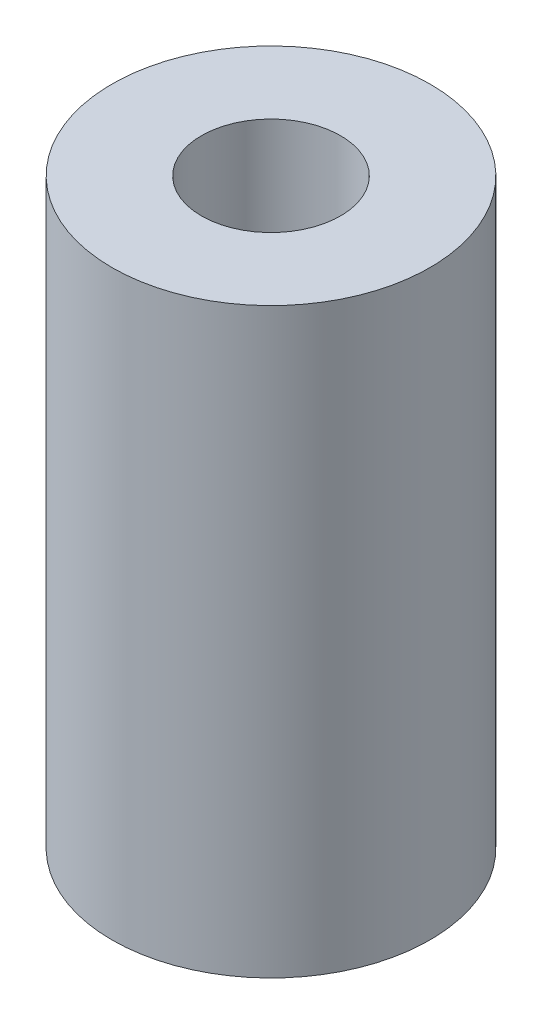
ISO-10303-21;
HEADER;
FILE_DESCRIPTION(('STEP AP214'),'2;1');
FILE_NAME('part.step','',(''),(''),'','','');
FILE_SCHEMA(('AUTOMOTIVE_DESIGN { 1 0 10303 214 1 1 1 1 }'));
ENDSEC;
DATA;
#1=APPLICATION_CONTEXT('core data for automotive mechanical design processes');
#2=APPLICATION_PROTOCOL_DEFINITION('international standard','automotive_design',2000,#1);
#3=PRODUCT_CONTEXT('',#1,'mechanical');
#4=PRODUCT('Part','Part','',(#3));
#5=PRODUCT_RELATED_PRODUCT_CATEGORY('part','',(#4));
#6=PRODUCT_DEFINITION_FORMATION('','',#4);
#7=PRODUCT_DEFINITION_CONTEXT('part definition',#1,'design');
#8=PRODUCT_DEFINITION('design','',#6,#7);
#9=PRODUCT_DEFINITION_SHAPE('','',#8);
#10=(LENGTH_UNIT() NAMED_UNIT(*) SI_UNIT(.MILLI.,.METRE.));
#11=(NAMED_UNIT(*) PLANE_ANGLE_UNIT() SI_UNIT($,.RADIAN.));
#12=(NAMED_UNIT(*) SI_UNIT($,.STERADIAN.) SOLID_ANGLE_UNIT());
#13=UNCERTAINTY_MEASURE_WITH_UNIT(LENGTH_MEASURE(1.E-05),#10,'distance_accuracy_value','');
#14=(GEOMETRIC_REPRESENTATION_CONTEXT(3) GLOBAL_UNCERTAINTY_ASSIGNED_CONTEXT((#13)) GLOBAL_UNIT_ASSIGNED_CONTEXT((#10,
#11,#12)) REPRESENTATION_CONTEXT('',''));
#15=CARTESIAN_POINT('',(0.,0.,0.));
#16=DIRECTION('',(0.,0.,1.));
#17=DIRECTION('',(1.,0.,0.));
#18=AXIS2_PLACEMENT_3D('',#15,#16,#17);
#19=CARTESIAN_POINT('',(0.,14.65,0.));
#20=DIRECTION('',(0.,1.,0.));
#21=DIRECTION('',(0.,0.,1.));
#22=AXIS2_PLACEMENT_3D('',#19,#20,#21);
#23=PLANE('',#22);
#24=CARTESIAN_POINT('',(0.,14.65,0.));
#25=DIRECTION('',(0.,1.,0.));
#26=DIRECTION('',(0.,0.,1.));
#27=AXIS2_PLACEMENT_3D('',#24,#25,#26);
#28=CIRCLE('',#27,4.);
#29=CARTESIAN_POINT('',(0.,14.65,4.));
#30=VERTEX_POINT('',#29);
#31=EDGE_CURVE('E10',#30,#30,#28,.T.);
#32=ORIENTED_EDGE('',*,*,#31,.T.);
#33=EDGE_LOOP('',(#32));
#34=FACE_BOUND('',#33,.T.);
#35=CARTESIAN_POINT('',(0.,14.65,0.));
#36=DIRECTION('',(0.,1.,0.));
#37=DIRECTION('',(0.,0.,1.));
#38=AXIS2_PLACEMENT_3D('',#35,#36,#37);
#39=CIRCLE('',#38,1.75);
#40=CARTESIAN_POINT('',(0.,14.65,1.75));
#41=VERTEX_POINT('',#40);
#42=EDGE_CURVE('E50',#41,#41,#39,.T.);
#43=ORIENTED_EDGE('',*,*,#42,.F.);
#44=EDGE_LOOP('',(#43));
#45=FACE_BOUND('',#44,.T.);
#46=ADVANCED_FACE('F39',(#34,#45),#23,.T.);
#47=CARTESIAN_POINT('',(0.,0.,0.));
#48=DIRECTION('',(0.,1.,0.));
#49=DIRECTION('',(0.,0.,1.));
#50=AXIS2_PLACEMENT_3D('',#47,#48,#49);
#51=PLANE('',#50);
#52=CARTESIAN_POINT('',(0.,0.,0.));
#53=DIRECTION('',(0.,1.,0.));
#54=DIRECTION('',(0.,0.,1.));
#55=AXIS2_PLACEMENT_3D('',#52,#53,#54);
#56=CIRCLE('',#55,4.);
#57=CARTESIAN_POINT('',(0.,0.,4.));
#58=VERTEX_POINT('',#57);
#59=EDGE_CURVE('E43',#58,#58,#56,.T.);
#60=ORIENTED_EDGE('',*,*,#59,.F.);
#61=EDGE_LOOP('',(#60));
#62=FACE_BOUND('',#61,.T.);
#63=CARTESIAN_POINT('',(0.,0.,0.));
#64=DIRECTION('',(0.,1.,0.));
#65=DIRECTION('',(0.,0.,1.));
#66=AXIS2_PLACEMENT_3D('',#63,#64,#65);
#67=CIRCLE('',#66,1.75);
#68=CARTESIAN_POINT('',(0.,0.,1.75));
#69=VERTEX_POINT('',#68);
#70=EDGE_CURVE('E52',#69,#69,#67,.T.);
#71=ORIENTED_EDGE('',*,*,#70,.T.);
#72=EDGE_LOOP('',(#71));
#73=FACE_BOUND('',#72,.T.);
#74=ADVANCED_FACE('F62',(#62,#73),#51,.F.);
#75=CARTESIAN_POINT('',(0.,14.65,0.));
#76=DIRECTION('',(0.,-1.,0.));
#77=DIRECTION('',(0.,0.,-1.));
#78=AXIS2_PLACEMENT_3D('',#75,#76,#77);
#79=CYLINDRICAL_SURFACE('',#78,4.);
#80=ORIENTED_EDGE('',*,*,#31,.F.);
#81=EDGE_LOOP('',(#80));
#82=FACE_BOUND('',#81,.T.);
#83=ORIENTED_EDGE('',*,*,#59,.T.);
#84=EDGE_LOOP('',(#83));
#85=FACE_BOUND('',#84,.T.);
#86=ADVANCED_FACE('F41',(#82,#85),#79,.T.);
#87=CARTESIAN_POINT('',(0.,14.65,0.));
#88=DIRECTION('',(0.,-1.,0.));
#89=DIRECTION('',(0.,0.,-1.));
#90=AXIS2_PLACEMENT_3D('',#87,#88,#89);
#91=CYLINDRICAL_SURFACE('',#90,1.75);
#92=ORIENTED_EDGE('',*,*,#42,.T.);
#93=EDGE_LOOP('',(#92));
#94=FACE_BOUND('',#93,.T.);
#95=ORIENTED_EDGE('',*,*,#70,.F.);
#96=EDGE_LOOP('',(#95));
#97=FACE_BOUND('',#96,.T.);
#98=ADVANCED_FACE('F58',(#94,#97),#91,.F.);
#99=CLOSED_SHELL('',(#46,#74,#86,#98));
#100=MANIFOLD_SOLID_BREP('B2',#99);
#101=ADVANCED_BREP_SHAPE_REPRESENTATION('',(#18,#100),#14);
#102=SHAPE_DEFINITION_REPRESENTATION(#9,#101);
ENDSEC;
END-ISO-10303-21;
